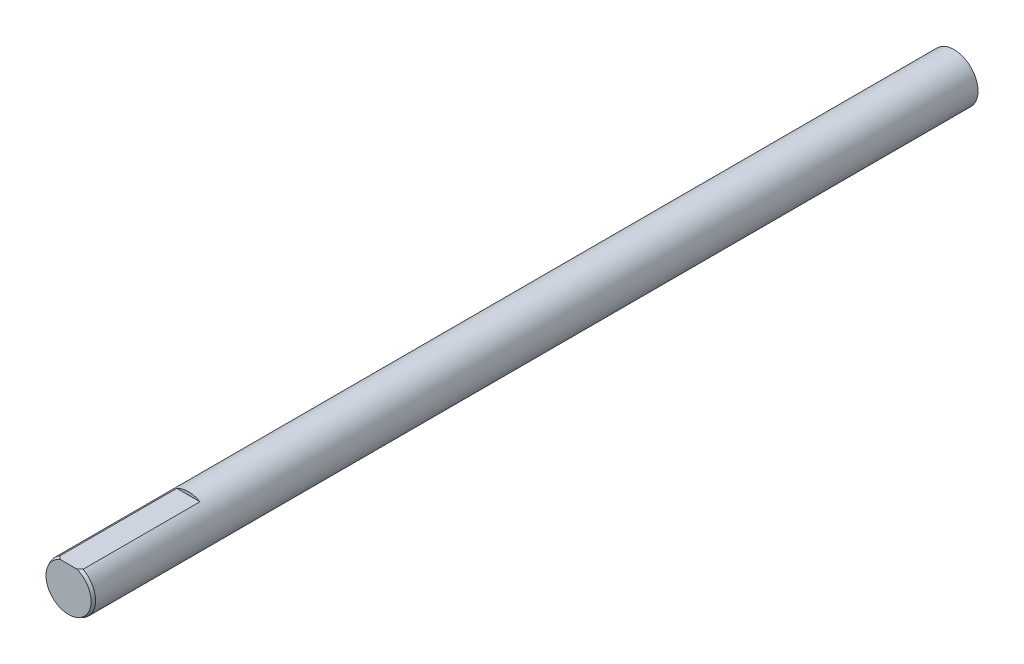
ISO-10303-21;
HEADER;
FILE_DESCRIPTION(('STEP AP214'),'2;1');
FILE_NAME('part.step','',(''),(''),'','','');
FILE_SCHEMA(('AUTOMOTIVE_DESIGN { 1 0 10303 214 1 1 1 1 }'));
ENDSEC;
DATA;
#1=APPLICATION_CONTEXT('core data for automotive mechanical design processes');
#2=APPLICATION_PROTOCOL_DEFINITION('international standard','automotive_design',2000,#1);
#3=PRODUCT_CONTEXT('',#1,'mechanical');
#4=PRODUCT('Part','Part','',(#3));
#5=PRODUCT_RELATED_PRODUCT_CATEGORY('part','',(#4));
#6=PRODUCT_DEFINITION_FORMATION('','',#4);
#7=PRODUCT_DEFINITION_CONTEXT('part definition',#1,'design');
#8=PRODUCT_DEFINITION('design','',#6,#7);
#9=PRODUCT_DEFINITION_SHAPE('','',#8);
#10=(LENGTH_UNIT() NAMED_UNIT(*) SI_UNIT(.MILLI.,.METRE.));
#11=(NAMED_UNIT(*) PLANE_ANGLE_UNIT() SI_UNIT($,.RADIAN.));
#12=(NAMED_UNIT(*) SI_UNIT($,.STERADIAN.) SOLID_ANGLE_UNIT());
#13=UNCERTAINTY_MEASURE_WITH_UNIT(LENGTH_MEASURE(1.E-05),#10,'distance_accuracy_value','');
#14=(GEOMETRIC_REPRESENTATION_CONTEXT(3) GLOBAL_UNCERTAINTY_ASSIGNED_CONTEXT((#13)) GLOBAL_UNIT_ASSIGNED_CONTEXT((#10,
#11,#12)) REPRESENTATION_CONTEXT('',''));
#15=CARTESIAN_POINT('',(0.,0.,0.));
#16=DIRECTION('',(0.,0.,1.));
#17=DIRECTION('',(1.,0.,0.));
#18=AXIS2_PLACEMENT_3D('',#15,#16,#17);
#19=CARTESIAN_POINT('',(0.,0.,148.));
#20=DIRECTION('',(0.,0.,-1.));
#21=DIRECTION('',(-1.,0.,0.));
#22=AXIS2_PLACEMENT_3D('',#19,#20,#21);
#23=CYLINDRICAL_SURFACE('',#22,4.);
#24=CARTESIAN_POINT('',(0.,0.,147.5));
#25=DIRECTION('',(0.,0.,1.));
#26=DIRECTION('',(1.,0.,0.));
#27=AXIS2_PLACEMENT_3D('',#24,#25,#26);
#28=CIRCLE('',#27,4.);
#29=CARTESIAN_POINT('',(1.93649167310371,3.5,147.5));
#30=VERTEX_POINT('',#29);
#31=CARTESIAN_POINT('',(-1.93649167310371,3.5,147.5));
#32=VERTEX_POINT('',#31);
#33=EDGE_CURVE('E89',#30,#32,#28,.F.);
#34=ORIENTED_EDGE('',*,*,#33,.T.);
#35=DIRECTION('',(0.,0.,1.));
#36=VECTOR('',#35,1.);
#37=CARTESIAN_POINT('',(-1.93649167310371,3.5,128.));
#38=LINE('',#37,#36);
#39=CARTESIAN_POINT('',(-1.93649167310371,3.5,128.));
#40=VERTEX_POINT('',#39);
#41=EDGE_CURVE('E82',#40,#32,#38,.T.);
#42=ORIENTED_EDGE('',*,*,#41,.F.);
#43=CARTESIAN_POINT('',(0.,0.,128.));
#44=DIRECTION('',(0.,0.,1.));
#45=DIRECTION('',(1.,0.,0.));
#46=AXIS2_PLACEMENT_3D('',#43,#44,#45);
#47=CIRCLE('',#46,4.);
#48=CARTESIAN_POINT('',(1.93649167310371,3.5,128.));
#49=VERTEX_POINT('',#48);
#50=EDGE_CURVE('E74',#49,#40,#47,.T.);
#51=ORIENTED_EDGE('',*,*,#50,.F.);
#52=DIRECTION('',(0.,0.,1.));
#53=VECTOR('',#52,1.);
#54=CARTESIAN_POINT('',(1.93649167310371,3.5,128.));
#55=LINE('',#54,#53);
#56=EDGE_CURVE('E84',#49,#30,#55,.T.);
#57=ORIENTED_EDGE('',*,*,#56,.T.);
#58=EDGE_LOOP('',(#34,#42,#51,#57));
#59=FACE_BOUND('',#58,.T.);
#60=CARTESIAN_POINT('',(0.,0.,0.233153829077487));
#61=DIRECTION('',(0.,0.,1.));
#62=DIRECTION('',(1.,0.,0.));
#63=AXIS2_PLACEMENT_3D('',#60,#61,#62);
#64=CIRCLE('',#63,4.);
#65=CARTESIAN_POINT('',(4.,0.,0.233153829077487));
#66=VERTEX_POINT('',#65);
#67=EDGE_CURVE('E95',#66,#66,#64,.T.);
#68=ORIENTED_EDGE('',*,*,#67,.T.);
#69=EDGE_LOOP('',(#68));
#70=FACE_BOUND('',#69,.T.);
#71=ADVANCED_FACE('F36',(#59,#70),#23,.T.);
#72=CARTESIAN_POINT('',(0.,0.,148.));
#73=DIRECTION('',(0.,0.,1.));
#74=DIRECTION('',(1.,0.,0.));
#75=AXIS2_PLACEMENT_3D('',#72,#73,#74);
#76=PLANE('',#75);
#77=DIRECTION('',(1.,0.,0.));
#78=VECTOR('',#77,1.);
#79=CARTESIAN_POINT('',(-1.93649167310371,3.5,148.));
#80=LINE('',#79,#78);
#81=CARTESIAN_POINT('',(-1.39252650796799,3.5,148.));
#82=VERTEX_POINT('',#81);
#83=CARTESIAN_POINT('',(1.39252650796799,3.5,148.));
#84=VERTEX_POINT('',#83);
#85=EDGE_CURVE('E57',#82,#84,#80,.T.);
#86=ORIENTED_EDGE('',*,*,#85,.F.);
#87=CARTESIAN_POINT('',(0.,0.,148.));
#88=DIRECTION('',(0.,0.,1.));
#89=DIRECTION('',(1.,0.,0.));
#90=AXIS2_PLACEMENT_3D('',#87,#88,#89);
#91=CIRCLE('',#90,3.7668461709225);
#92=EDGE_CURVE('E100',#82,#84,#91,.T.);
#93=ORIENTED_EDGE('',*,*,#92,.T.);
#94=EDGE_LOOP('',(#86,#93));
#95=FACE_BOUND('',#94,.T.);
#96=ADVANCED_FACE('F104',(#95),#76,.T.);
#97=CARTESIAN_POINT('',(0.,0.,0.));
#98=DIRECTION('',(0.,0.,1.));
#99=DIRECTION('',(1.,0.,0.));
#100=AXIS2_PLACEMENT_3D('',#97,#98,#99);
#101=PLANE('',#100);
#102=CARTESIAN_POINT('',(0.,0.,0.));
#103=DIRECTION('',(0.,0.,1.));
#104=DIRECTION('',(1.,0.,0.));
#105=AXIS2_PLACEMENT_3D('',#102,#103,#104);
#106=CIRCLE('',#105,3.5);
#107=CARTESIAN_POINT('',(3.5,0.,0.));
#108=VERTEX_POINT('',#107);
#109=EDGE_CURVE('E98',#108,#108,#106,.F.);
#110=ORIENTED_EDGE('',*,*,#109,.T.);
#111=EDGE_LOOP('',(#110));
#112=FACE_BOUND('',#111,.T.);
#113=ADVANCED_FACE('F112',(#112),#101,.F.);
#114=CARTESIAN_POINT('',(0.,0.,0.233153829077487));
#115=DIRECTION('',(0.,0.,1.));
#116=DIRECTION('',(1.,0.,0.));
#117=AXIS2_PLACEMENT_3D('',#114,#115,#116);
#118=CONICAL_SURFACE('',#117,4.,1.13446401379633);
#119=CARTESIAN_POINT('',(3.5,0.,0.));
#120=CARTESIAN_POINT('',(3.50520833333334,0.,0.00242868571955718));
#121=CARTESIAN_POINT('',(3.51041666666667,0.,0.00485737143911433));
#122=CARTESIAN_POINT('',(3.52083333333334,0.,0.00971474287822862));
#123=CARTESIAN_POINT('',(3.52604166666667,0.,0.0121434285977858));
#124=CARTESIAN_POINT('',(3.53645833333334,0.,0.0170008000369001));
#125=CARTESIAN_POINT('',(3.54166666666667,0.,0.0194294857564572));
#126=CARTESIAN_POINT('',(3.55208333333334,0.,0.0242868571955715));
#127=CARTESIAN_POINT('',(3.55729166666667,0.,0.0267155429151287));
#128=CARTESIAN_POINT('',(3.56770833333334,0.,0.031572914354243));
#129=CARTESIAN_POINT('',(3.57291666666667,0.,0.0340016000738002));
#130=CARTESIAN_POINT('',(3.58333333333334,0.,0.0388589715129145));
#131=CARTESIAN_POINT('',(3.58854166666667,0.,0.0412876572324716));
#132=CARTESIAN_POINT('',(3.59895833333334,0.,0.0461450286715859));
#133=CARTESIAN_POINT('',(3.60416666666667,0.,0.0485737143911431));
#134=CARTESIAN_POINT('',(3.61458333333334,0.,0.0534310858302574));
#135=CARTESIAN_POINT('',(3.61979166666667,0.,0.0558597715498145));
#136=CARTESIAN_POINT('',(3.63020833333334,0.,0.0607171429889289));
#137=CARTESIAN_POINT('',(3.63541666666667,0.,0.0631458287084861));
#138=CARTESIAN_POINT('',(3.64583333333334,0.,0.0680032001476004));
#139=CARTESIAN_POINT('',(3.65104166666667,0.,0.0704318858671575));
#140=CARTESIAN_POINT('',(3.66145833333334,0.,0.0752892573062718));
#141=CARTESIAN_POINT('',(3.66666666666667,0.,0.077717943025829));
#142=CARTESIAN_POINT('',(3.67708333333334,0.,0.0825753144649433));
#143=CARTESIAN_POINT('',(3.68229166666667,0.,0.0850040001845005));
#144=CARTESIAN_POINT('',(3.69270833333334,0.,0.0898613716236148));
#145=CARTESIAN_POINT('',(3.69791666666667,0.,0.092290057343172));
#146=CARTESIAN_POINT('',(3.70833333333333,0.,0.0971474287822863));
#147=CARTESIAN_POINT('',(3.71354166666667,0.,0.0995761145018434));
#148=CARTESIAN_POINT('',(3.72395833333333,0.,0.104433485940958));
#149=CARTESIAN_POINT('',(3.72916666666667,0.,0.106862171660515));
#150=CARTESIAN_POINT('',(3.73958333333333,0.,0.111719543099629));
#151=CARTESIAN_POINT('',(3.74479166666667,0.,0.114148228819186));
#152=CARTESIAN_POINT('',(3.75520833333333,0.,0.119005600258301));
#153=CARTESIAN_POINT('',(3.76041666666667,0.,0.121434285977858));
#154=CARTESIAN_POINT('',(3.77083333333333,0.,0.126291657416972));
#155=CARTESIAN_POINT('',(3.77604166666667,0.,0.128720343136529));
#156=CARTESIAN_POINT('',(3.78645833333333,0.,0.133577714575644));
#157=CARTESIAN_POINT('',(3.79166666666667,0.,0.136006400295201));
#158=CARTESIAN_POINT('',(3.80208333333333,0.,0.140863771734315));
#159=CARTESIAN_POINT('',(3.80729166666667,0.,0.143292457453872));
#160=CARTESIAN_POINT('',(3.81770833333333,0.,0.148149828892987));
#161=CARTESIAN_POINT('',(3.82291666666667,0.,0.150578514612544));
#162=CARTESIAN_POINT('',(3.83333333333333,0.,0.155435886051658));
#163=CARTESIAN_POINT('',(3.83854166666667,0.,0.157864571771215));
#164=CARTESIAN_POINT('',(3.84895833333333,0.,0.16272194321033));
#165=CARTESIAN_POINT('',(3.85416666666667,0.,0.165150628929887));
#166=CARTESIAN_POINT('',(3.86458333333333,0.,0.170008000369001));
#167=CARTESIAN_POINT('',(3.86979166666667,0.,0.172436686088558));
#168=CARTESIAN_POINT('',(3.88020833333333,0.,0.177294057527672));
#169=CARTESIAN_POINT('',(3.88541666666667,0.,0.17972274324723));
#170=CARTESIAN_POINT('',(3.89583333333333,0.,0.184580114686344));
#171=CARTESIAN_POINT('',(3.90104166666667,0.,0.187008800405901));
#172=CARTESIAN_POINT('',(3.91145833333333,0.,0.191866171845015));
#173=CARTESIAN_POINT('',(3.91666666666667,0.,0.194294857564572));
#174=CARTESIAN_POINT('',(3.92708333333333,0.,0.199152229003687));
#175=CARTESIAN_POINT('',(3.93229166666667,0.,0.201580914723244));
#176=CARTESIAN_POINT('',(3.94270833333333,0.,0.206438286162358));
#177=CARTESIAN_POINT('',(3.94791666666667,0.,0.208866971881915));
#178=CARTESIAN_POINT('',(3.95833333333333,0.,0.21372434332103));
#179=CARTESIAN_POINT('',(3.96354166666667,0.,0.216153029040587));
#180=CARTESIAN_POINT('',(3.97395833333333,0.,0.221010400479701));
#181=CARTESIAN_POINT('',(3.97916666666667,0.,0.223439086199258));
#182=CARTESIAN_POINT('',(3.98958333333333,0.,0.228296457638373));
#183=CARTESIAN_POINT('',(3.99479166666667,0.,0.23072514335793));
#184=CARTESIAN_POINT('',(4.,0.,0.233153829077487));
#185=B_SPLINE_CURVE_WITH_KNOTS('',3,(#119,#120,#121,#122,#123,#124,#125,#126,#127,#128,#129,
#130,#131,#132,#133,#134,#135,#136,#137,#138,#139,#140,#141,#142,#143,#144,#145,#146,#147,#148,
#149,#150,#151,#152,#153,#154,#155,#156,#157,#158,#159,#160,#161,#162,#163,#164,#165,#166,#167,
#168,#169,#170,#171,#172,#173,#174,#175,#176,#177,#178,#179,#180,#181,#182,#183,#184),
.UNSPECIFIED.,.F.,.F.,(4,2,2,2,2,2,2,2,2,2,2,2,2,2,2,2,2,2,2,2,2,2,2,2,2,2,2,2,2,2,2,2,4),(0.,
0.0172402799837884,0.0344805599675772,0.051720839951366,0.0689611199351547,0.0862013999189431,
0.103441679902732,0.120681959886521,0.137922239870309,0.155162519854098,0.172402799837887,
0.189643079821675,0.206883359805464,0.224123639789253,0.241363919773041,0.25860419975683,
0.275844479740619,0.293084759724408,0.310325039708196,0.327565319691985,0.344805599675774,
0.362045879659562,0.379286159643351,0.39652643962714,0.413766719610928,0.431006999594717,
0.448247279578506,0.465487559562295,0.482727839546083,0.499968119529872,0.51720839951366,
0.534448679497449,0.551688959481238),.UNSPECIFIED.);
#186=EDGE_CURVE('BSEAM107',#108,#66,#185,.T.);
#187=ORIENTED_EDGE('',*,*,#109,.F.);
#188=ORIENTED_EDGE('',*,*,#67,.F.);
#189=ORIENTED_EDGE('',*,*,#186,.T.);
#190=ORIENTED_EDGE('',*,*,#186,.F.);
#191=EDGE_LOOP('',(#187,#189,#188,#190));
#192=FACE_BOUND('',#191,.T.);
#193=ADVANCED_FACE('F107',(#192),#118,.T.);
#194=CARTESIAN_POINT('',(0.,0.,148.));
#195=DIRECTION('',(0.,0.,-1.));
#196=DIRECTION('',(-1.,0.,0.));
#197=AXIS2_PLACEMENT_3D('',#194,#195,#196);
#198=CONICAL_SURFACE('',#197,3.7668461709225,0.436332312998579);
#199=CARTESIAN_POINT('',(-3.69938659904734,3.5,145.156725097228));
#200=CARTESIAN_POINT('',(-3.62125907639243,3.5,145.278398674264));
#201=CARTESIAN_POINT('',(-3.54232889046264,3.5,145.399565552065));
#202=CARTESIAN_POINT('',(-3.38249323288122,3.5,145.640646069281));
#203=CARTESIAN_POINT('',(-3.30158711198781,3.5,145.760559277777));
#204=CARTESIAN_POINT('',(-3.13638124748411,3.5,146.000408138186));
#205=CARTESIAN_POINT('',(-3.05205054994083,3.5,146.120322541267));
#206=CARTESIAN_POINT('',(-2.88056559101875,3.5,146.358092762301));
#207=CARTESIAN_POINT('',(-2.79341177934904,3.5,146.475948903569));
#208=CARTESIAN_POINT('',(-2.6099145085456,3.5,146.716563474637));
#209=CARTESIAN_POINT('',(-2.51334098875503,3.5,146.839147340308));
#210=CARTESIAN_POINT('',(-2.3153069384881,3.5,147.080295442968));
#211=CARTESIAN_POINT('',(-2.21384740512972,3.5,147.198860491758));
#212=CARTESIAN_POINT('',(-2.00525554194988,3.5,147.429759277606));
#213=CARTESIAN_POINT('',(-1.89815708354365,3.5,147.542123410687));
#214=CARTESIAN_POINT('',(-1.676081715856,3.5,147.758710121899));
#215=CARTESIAN_POINT('',(-1.56111471914689,3.5,147.862942602143));
#216=CARTESIAN_POINT('',(-1.39343521000766,3.5,147.999825263658));
#217=CARTESIAN_POINT('',(-1.34500355499747,3.5,148.03772746254));
#218=CARTESIAN_POINT('',(-1.24635555556542,3.5,148.111175747641));
#219=CARTESIAN_POINT('',(-1.19613870630159,3.5,148.146721159101));
#220=CARTESIAN_POINT('',(-1.09392162992805,3.5,148.214873121226));
#221=CARTESIAN_POINT('',(-1.04192652988203,3.5,148.247487275236));
#222=CARTESIAN_POINT('',(-0.935959030442086,3.5,148.309283931855));
#223=CARTESIAN_POINT('',(-0.881986608209037,3.5,148.338466394809));
#224=CARTESIAN_POINT('',(-0.714861071575003,3.5,148.420850461418));
#225=CARTESIAN_POINT('',(-0.598289787879076,3.5,148.467638953626));
#226=CARTESIAN_POINT('',(-0.418491903759455,3.5,148.519864019754));
#227=CARTESIAN_POINT('',(-0.357811832838408,3.5,148.53427283759));
#228=CARTESIAN_POINT('',(-0.235232244747814,3.5,148.556457135253));
#229=CARTESIAN_POINT('',(-0.173333078415422,3.5,148.564234495778));
#230=CARTESIAN_POINT('',(-0.0569370335516037,3.5,148.572161823676));
#231=CARTESIAN_POINT('',(-0.00249652693145198,3.5,148.573153729361));
#232=CARTESIAN_POINT('',(0.106220007725172,3.5,148.56970529624));
#233=CARTESIAN_POINT('',(0.160495977750781,3.5,148.565263224385));
#234=CARTESIAN_POINT('',(0.322384706763156,3.5,148.544002896659));
#235=CARTESIAN_POINT('',(0.429007986125564,3.5,148.519247354061));
#236=CARTESIAN_POINT('',(0.660255012004489,3.5,148.444691274962));
#237=CARTESIAN_POINT('',(0.783390404877248,3.5,148.3904452081));
#238=CARTESIAN_POINT('',(0.960683524392718,3.5,148.295618727627));
#239=CARTESIAN_POINT('',(1.01863861158454,3.5,148.261697675503));
#240=CARTESIAN_POINT('',(1.13222261996494,3.5,148.190151807485));
#241=CARTESIAN_POINT('',(1.18785183189775,3.5,148.152527456504));
#242=CARTESIAN_POINT('',(1.31460220737325,3.5,148.061604080543));
#243=CARTESIAN_POINT('',(1.38490666389536,3.5,148.007174576907));
#244=CARTESIAN_POINT('',(1.52219088754986,3.5,147.89425164005));
#245=CARTESIAN_POINT('',(1.58916909647411,3.5,147.83575633239));
#246=CARTESIAN_POINT('',(1.7859944125055,3.5,147.655380542781));
#247=CARTESIAN_POINT('',(1.91150724273485,3.5,147.528779915449));
#248=CARTESIAN_POINT('',(2.15474655430673,3.5,147.266777291371));
#249=CARTESIAN_POINT('',(2.27240985563947,3.5,147.131318043676));
#250=CARTESIAN_POINT('',(2.50102311382453,3.5,146.855097938634));
#251=CARTESIAN_POINT('',(2.61197934008079,3.5,146.714342238285));
#252=CARTESIAN_POINT('',(2.80792500412523,3.5,146.45645723727));
#253=CARTESIAN_POINT('',(2.89380148621377,3.5,146.339995625106));
#254=CARTESIAN_POINT('',(3.06283386132093,3.5,146.105077245649));
#255=CARTESIAN_POINT('',(3.14598913113609,3.5,145.986620030609));
#256=CARTESIAN_POINT('',(3.30856811212643,3.5,145.750248495952));
#257=CARTESIAN_POINT('',(3.38803179584729,3.5,145.632361566302));
#258=CARTESIAN_POINT('',(3.54505075370049,3.5,145.395388041451));
#259=CARTESIAN_POINT('',(3.62260675628574,3.5,145.276301929433));
#260=CARTESIAN_POINT('',(3.69938659904734,3.5,145.156725097228));
#261=B_SPLINE_CURVE_WITH_KNOTS('',3,(#199,#200,#201,#202,#203,#204,#205,#206,#207,#208,#209,
#210,#211,#212,#213,#214,#215,#216,#217,#218,#219,#220,#221,#222,#223,#224,#225,#226,#227,#228,
#229,#230,#231,#232,#233,#234,#235,#236,#237,#238,#239,#240,#241,#242,#243,#244,#245,#246,#247,
#248,#249,#250,#251,#252,#253,#254,#255,#256,#257,#258,#259,#260),.UNSPECIFIED.,.F.,.F.,(4,2,2,
2,2,2,2,2,2,2,2,2,2,2,2,2,2,2,2,2,2,2,2,2,2,2,2,2,2,2,4),(0.,0.433799553196496,
0.867743612210629,1.3075049631437,1.74719660331887,2.21526758344102,2.68324344300053,
3.14867290276927,3.61352645198664,3.7979682211033,3.98246257075032,4.1664636502106,
4.35046685565161,4.72497372980492,4.9117776971157,5.09852866868064,5.26160519352458,
5.42473374164225,5.75113930793779,6.15249276884022,6.35385675479576,6.55519549368222,
6.82173238446452,7.0883929810724,7.62255555674508,8.16059813370722,8.69812974284587,
9.13218841626989,9.56634581048615,9.99283198142276,10.4191526866317),.UNSPECIFIED.);
#262=EDGE_CURVE('E11',#32,#82,#261,.T.);
#263=ORIENTED_EDGE('',*,*,#262,.F.);
#264=ORIENTED_EDGE('',*,*,#33,.F.);
#265=EDGE_CURVE('E42',#84,#30,#261,.T.);
#266=ORIENTED_EDGE('',*,*,#265,.F.);
#267=ORIENTED_EDGE('',*,*,#92,.F.);
#268=EDGE_LOOP('',(#263,#264,#266,#267));
#269=FACE_BOUND('',#268,.T.);
#270=ADVANCED_FACE('F39',(#269),#198,.T.);
#271=CARTESIAN_POINT('',(-1.93649167310371,3.5,128.));
#272=DIRECTION('',(0.,-1.,0.));
#273=DIRECTION('',(0.,0.,-1.));
#274=AXIS2_PLACEMENT_3D('',#271,#272,#273);
#275=PLANE('',#274);
#276=ORIENTED_EDGE('',*,*,#262,.T.);
#277=ORIENTED_EDGE('',*,*,#85,.T.);
#278=ORIENTED_EDGE('',*,*,#265,.T.);
#279=ORIENTED_EDGE('',*,*,#56,.F.);
#280=DIRECTION('',(1.,0.,0.));
#281=VECTOR('',#280,1.);
#282=CARTESIAN_POINT('',(-1.93649167310371,3.5,128.));
#283=LINE('',#282,#281);
#284=EDGE_CURVE('E77',#40,#49,#283,.T.);
#285=ORIENTED_EDGE('',*,*,#284,.F.);
#286=ORIENTED_EDGE('',*,*,#41,.T.);
#287=EDGE_LOOP('',(#276,#277,#278,#279,#285,#286));
#288=FACE_BOUND('',#287,.T.);
#289=ADVANCED_FACE('F81',(#288),#275,.F.);
#290=CARTESIAN_POINT('',(0.,0.,128.));
#291=DIRECTION('',(0.,0.,1.));
#292=DIRECTION('',(1.,0.,0.));
#293=AXIS2_PLACEMENT_3D('',#290,#291,#292);
#294=PLANE('',#293);
#295=ORIENTED_EDGE('',*,*,#50,.T.);
#296=ORIENTED_EDGE('',*,*,#284,.T.);
#297=EDGE_LOOP('',(#295,#296));
#298=FACE_BOUND('',#297,.T.);
#299=ADVANCED_FACE('F76',(#298),#294,.T.);
#300=CLOSED_SHELL('',(#71,#96,#113,#193,#270,#289,#299));
#301=MANIFOLD_SOLID_BREP('B2',#300);
#302=ADVANCED_BREP_SHAPE_REPRESENTATION('',(#18,#301),#14);
#303=SHAPE_DEFINITION_REPRESENTATION(#9,#302);
ENDSEC;
END-ISO-10303-21;
